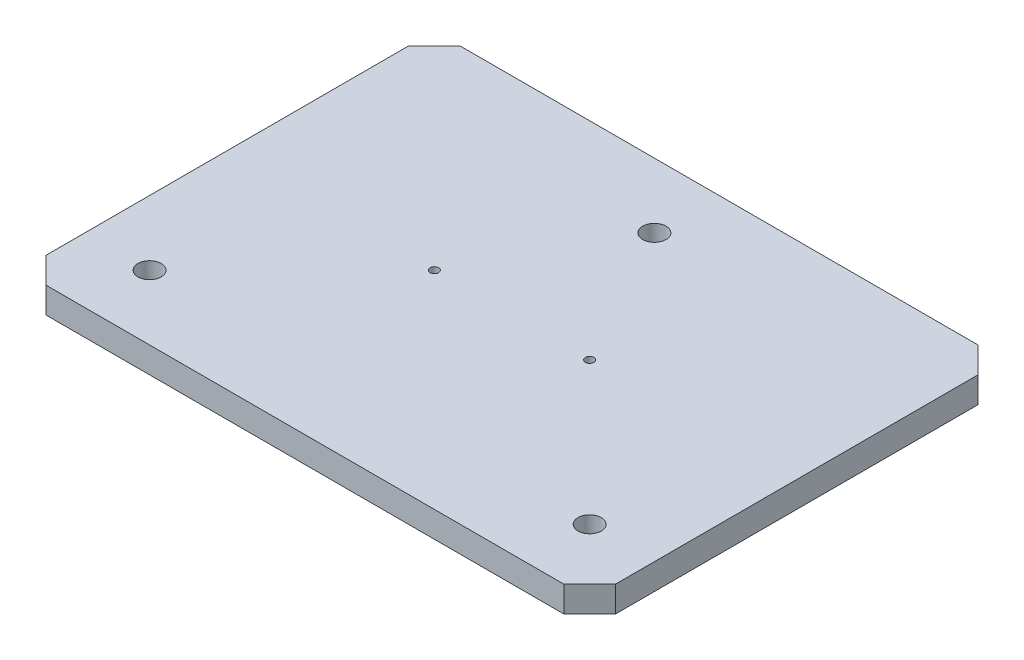
ISO-10303-21;
HEADER;
FILE_DESCRIPTION(('STEP AP214'),'2;1');
FILE_NAME('part.step','',(''),(''),'','','');
FILE_SCHEMA(('AUTOMOTIVE_DESIGN { 1 0 10303 214 1 1 1 1 }'));
ENDSEC;
DATA;
#1=APPLICATION_CONTEXT('core data for automotive mechanical design processes');
#2=APPLICATION_PROTOCOL_DEFINITION('international standard','automotive_design',2000,#1);
#3=PRODUCT_CONTEXT('',#1,'mechanical');
#4=PRODUCT('Part','Part','',(#3));
#5=PRODUCT_RELATED_PRODUCT_CATEGORY('part','',(#4));
#6=PRODUCT_DEFINITION_FORMATION('','',#4);
#7=PRODUCT_DEFINITION_CONTEXT('part definition',#1,'design');
#8=PRODUCT_DEFINITION('design','',#6,#7);
#9=PRODUCT_DEFINITION_SHAPE('','',#8);
#10=(LENGTH_UNIT() NAMED_UNIT(*) SI_UNIT(.MILLI.,.METRE.));
#11=(NAMED_UNIT(*) PLANE_ANGLE_UNIT() SI_UNIT($,.RADIAN.));
#12=(NAMED_UNIT(*) SI_UNIT($,.STERADIAN.) SOLID_ANGLE_UNIT());
#13=UNCERTAINTY_MEASURE_WITH_UNIT(LENGTH_MEASURE(1.E-05),#10,'distance_accuracy_value','');
#14=(GEOMETRIC_REPRESENTATION_CONTEXT(3) GLOBAL_UNCERTAINTY_ASSIGNED_CONTEXT((#13)) GLOBAL_UNIT_ASSIGNED_CONTEXT((#10,
#11,#12)) REPRESENTATION_CONTEXT('',''));
#15=CARTESIAN_POINT('',(0.,0.,0.));
#16=DIRECTION('',(0.,0.,1.));
#17=DIRECTION('',(1.,0.,0.));
#18=AXIS2_PLACEMENT_3D('',#15,#16,#17);
#19=CARTESIAN_POINT('',(-110.,10.,80.));
#20=DIRECTION('',(1.,0.,0.));
#21=DIRECTION('',(0.,0.,-1.));
#22=AXIS2_PLACEMENT_3D('',#19,#20,#21);
#23=PLANE('',#22);
#24=DIRECTION('',(0.,0.,1.));
#25=VECTOR('',#24,1.);
#26=CARTESIAN_POINT('',(-110.,10.,80.));
#27=LINE('',#26,#25);
#28=CARTESIAN_POINT('',(-110.,10.,-70.));
#29=VERTEX_POINT('',#28);
#30=CARTESIAN_POINT('',(-110.,10.,70.));
#31=VERTEX_POINT('',#30);
#32=EDGE_CURVE('E135',#29,#31,#27,.T.);
#33=ORIENTED_EDGE('',*,*,#32,.F.);
#34=DIRECTION('',(0.,-1.,0.));
#35=VECTOR('',#34,1.);
#36=CARTESIAN_POINT('',(-110.,10.,-70.));
#37=LINE('',#36,#35);
#38=CARTESIAN_POINT('',(-110.,0.,-70.));
#39=VERTEX_POINT('',#38);
#40=EDGE_CURVE('E120',#29,#39,#37,.T.);
#41=ORIENTED_EDGE('',*,*,#40,.T.);
#42=DIRECTION('',(0.,0.,1.));
#43=VECTOR('',#42,1.);
#44=CARTESIAN_POINT('',(-110.,0.,80.));
#45=LINE('',#44,#43);
#46=CARTESIAN_POINT('',(-110.,0.,70.));
#47=VERTEX_POINT('',#46);
#48=EDGE_CURVE('E132',#39,#47,#45,.T.);
#49=ORIENTED_EDGE('',*,*,#48,.T.);
#50=DIRECTION('',(0.,1.,0.));
#51=VECTOR('',#50,1.);
#52=CARTESIAN_POINT('',(-110.,10.,70.));
#53=LINE('',#52,#51);
#54=EDGE_CURVE('E137',#47,#31,#53,.T.);
#55=ORIENTED_EDGE('',*,*,#54,.T.);
#56=EDGE_LOOP('',(#33,#41,#49,#55));
#57=FACE_BOUND('',#56,.T.);
#58=ADVANCED_FACE('F50',(#57),#23,.F.);
#59=CARTESIAN_POINT('',(110.,10.,80.));
#60=DIRECTION('',(0.,0.,-1.));
#61=DIRECTION('',(-1.,0.,0.));
#62=AXIS2_PLACEMENT_3D('',#59,#60,#61);
#63=PLANE('',#62);
#64=DIRECTION('',(1.,0.,0.));
#65=VECTOR('',#64,1.);
#66=CARTESIAN_POINT('',(110.,0.,80.));
#67=LINE('',#66,#65);
#68=CARTESIAN_POINT('',(-100.,0.,80.));
#69=VERTEX_POINT('',#68);
#70=CARTESIAN_POINT('',(100.,0.,80.));
#71=VERTEX_POINT('',#70);
#72=EDGE_CURVE('E141',#69,#71,#67,.T.);
#73=ORIENTED_EDGE('',*,*,#72,.T.);
#74=DIRECTION('',(0.,1.,0.));
#75=VECTOR('',#74,1.);
#76=CARTESIAN_POINT('',(100.,10.,80.));
#77=LINE('',#76,#75);
#78=CARTESIAN_POINT('',(100.,10.,80.));
#79=VERTEX_POINT('',#78);
#80=EDGE_CURVE('E13',#71,#79,#77,.T.);
#81=ORIENTED_EDGE('',*,*,#80,.T.);
#82=DIRECTION('',(1.,0.,0.));
#83=VECTOR('',#82,1.);
#84=CARTESIAN_POINT('',(110.,10.,80.));
#85=LINE('',#84,#83);
#86=CARTESIAN_POINT('',(-100.,10.,80.));
#87=VERTEX_POINT('',#86);
#88=EDGE_CURVE('E181',#87,#79,#85,.T.);
#89=ORIENTED_EDGE('',*,*,#88,.F.);
#90=DIRECTION('',(0.,-1.,0.));
#91=VECTOR('',#90,1.);
#92=CARTESIAN_POINT('',(-100.,10.,80.));
#93=LINE('',#92,#91);
#94=EDGE_CURVE('E58',#87,#69,#93,.T.);
#95=ORIENTED_EDGE('',*,*,#94,.T.);
#96=EDGE_LOOP('',(#73,#81,#89,#95));
#97=FACE_BOUND('',#96,.T.);
#98=ADVANCED_FACE('F179',(#97),#63,.F.);
#99=CARTESIAN_POINT('',(110.,10.,80.));
#100=DIRECTION('',(-1.,0.,0.));
#101=DIRECTION('',(0.,0.,1.));
#102=AXIS2_PLACEMENT_3D('',#99,#100,#101);
#103=PLANE('',#102);
#104=DIRECTION('',(0.,0.,-1.));
#105=VECTOR('',#104,1.);
#106=CARTESIAN_POINT('',(110.,0.,80.));
#107=LINE('',#106,#105);
#108=CARTESIAN_POINT('',(110.,0.,70.));
#109=VERTEX_POINT('',#108);
#110=CARTESIAN_POINT('',(110.,0.,-70.));
#111=VERTEX_POINT('',#110);
#112=EDGE_CURVE('E145',#109,#111,#107,.T.);
#113=ORIENTED_EDGE('',*,*,#112,.T.);
#114=DIRECTION('',(0.,1.,0.));
#115=VECTOR('',#114,1.);
#116=CARTESIAN_POINT('',(110.,10.,-70.));
#117=LINE('',#116,#115);
#118=CARTESIAN_POINT('',(110.,10.,-70.));
#119=VERTEX_POINT('',#118);
#120=EDGE_CURVE('E65',#111,#119,#117,.T.);
#121=ORIENTED_EDGE('',*,*,#120,.T.);
#122=DIRECTION('',(0.,0.,-1.));
#123=VECTOR('',#122,1.);
#124=CARTESIAN_POINT('',(110.,10.,80.));
#125=LINE('',#124,#123);
#126=CARTESIAN_POINT('',(110.,10.,70.));
#127=VERTEX_POINT('',#126);
#128=EDGE_CURVE('E189',#127,#119,#125,.T.);
#129=ORIENTED_EDGE('',*,*,#128,.F.);
#130=DIRECTION('',(0.,-1.,0.));
#131=VECTOR('',#130,1.);
#132=CARTESIAN_POINT('',(110.,10.,70.));
#133=LINE('',#132,#131);
#134=EDGE_CURVE('E172',#127,#109,#133,.T.);
#135=ORIENTED_EDGE('',*,*,#134,.T.);
#136=EDGE_LOOP('',(#113,#121,#129,#135));
#137=FACE_BOUND('',#136,.T.);
#138=ADVANCED_FACE('F188',(#137),#103,.F.);
#139=CARTESIAN_POINT('',(110.,10.,-80.));
#140=DIRECTION('',(0.,0.,1.));
#141=DIRECTION('',(1.,0.,0.));
#142=AXIS2_PLACEMENT_3D('',#139,#140,#141);
#143=PLANE('',#142);
#144=DIRECTION('',(-1.,0.,0.));
#145=VECTOR('',#144,1.);
#146=CARTESIAN_POINT('',(110.,0.,-80.));
#147=LINE('',#146,#145);
#148=CARTESIAN_POINT('',(100.,0.,-80.));
#149=VERTEX_POINT('',#148);
#150=CARTESIAN_POINT('',(-99.9999999999999,0.,-80.));
#151=VERTEX_POINT('',#150);
#152=EDGE_CURVE('E155',#149,#151,#147,.T.);
#153=ORIENTED_EDGE('',*,*,#152,.T.);
#154=DIRECTION('',(0.,1.,0.));
#155=VECTOR('',#154,1.);
#156=CARTESIAN_POINT('',(-99.9999999999999,10.,-80.));
#157=LINE('',#156,#155);
#158=CARTESIAN_POINT('',(-99.9999999999999,10.,-80.));
#159=VERTEX_POINT('',#158);
#160=EDGE_CURVE('E121',#151,#159,#157,.T.);
#161=ORIENTED_EDGE('',*,*,#160,.T.);
#162=DIRECTION('',(-1.,0.,0.));
#163=VECTOR('',#162,1.);
#164=CARTESIAN_POINT('',(110.,10.,-80.));
#165=LINE('',#164,#163);
#166=CARTESIAN_POINT('',(100.,10.,-80.));
#167=VERTEX_POINT('',#166);
#168=EDGE_CURVE('E151',#167,#159,#165,.T.);
#169=ORIENTED_EDGE('',*,*,#168,.F.);
#170=DIRECTION('',(0.,-1.,0.));
#171=VECTOR('',#170,1.);
#172=CARTESIAN_POINT('',(100.,10.,-80.));
#173=LINE('',#172,#171);
#174=EDGE_CURVE('E126',#167,#149,#173,.T.);
#175=ORIENTED_EDGE('',*,*,#174,.T.);
#176=EDGE_LOOP('',(#153,#161,#169,#175));
#177=FACE_BOUND('',#176,.T.);
#178=ADVANCED_FACE('F227',(#177),#143,.F.);
#179=CARTESIAN_POINT('',(0.,10.,0.));
#180=DIRECTION('',(0.,1.,0.));
#181=DIRECTION('',(0.,0.,1.));
#182=AXIS2_PLACEMENT_3D('',#179,#180,#181);
#183=PLANE('',#182);
#184=CARTESIAN_POINT('',(-30.,10.,0.));
#185=DIRECTION('',(0.,1.,0.));
#186=DIRECTION('',(0.,0.,1.));
#187=AXIS2_PLACEMENT_3D('',#184,#185,#186);
#188=CIRCLE('',#187,1.64999999999999);
#189=CARTESIAN_POINT('',(-30.,10.,1.64999999999999));
#190=VERTEX_POINT('',#189);
#191=EDGE_CURVE('E218',#190,#190,#188,.T.);
#192=ORIENTED_EDGE('',*,*,#191,.F.);
#193=EDGE_LOOP('',(#192));
#194=FACE_BOUND('',#193,.T.);
#195=CARTESIAN_POINT('',(30.,10.,0.));
#196=DIRECTION('',(0.,1.,0.));
#197=DIRECTION('',(0.,0.,1.));
#198=AXIS2_PLACEMENT_3D('',#195,#196,#197);
#199=CIRCLE('',#198,1.64999999999998);
#200=CARTESIAN_POINT('',(30.,10.,1.64999999999998));
#201=VERTEX_POINT('',#200);
#202=EDGE_CURVE('E212',#201,#201,#199,.T.);
#203=ORIENTED_EDGE('',*,*,#202,.F.);
#204=EDGE_LOOP('',(#203));
#205=FACE_BOUND('',#204,.T.);
#206=CARTESIAN_POINT('',(0.,10.,-55.));
#207=DIRECTION('',(0.,1.,0.));
#208=DIRECTION('',(0.,0.,1.));
#209=AXIS2_PLACEMENT_3D('',#206,#207,#208);
#210=CIRCLE('',#209,4.5);
#211=CARTESIAN_POINT('',(0.,10.,-50.5));
#212=VERTEX_POINT('',#211);
#213=EDGE_CURVE('E206',#212,#212,#210,.T.);
#214=ORIENTED_EDGE('',*,*,#213,.F.);
#215=EDGE_LOOP('',(#214));
#216=FACE_BOUND('',#215,.T.);
#217=CARTESIAN_POINT('',(-85.,10.,55.));
#218=DIRECTION('',(0.,1.,0.));
#219=DIRECTION('',(0.,0.,1.));
#220=AXIS2_PLACEMENT_3D('',#217,#218,#219);
#221=CIRCLE('',#220,4.5);
#222=CARTESIAN_POINT('',(-85.,10.,59.5));
#223=VERTEX_POINT('',#222);
#224=EDGE_CURVE('E200',#223,#223,#221,.T.);
#225=ORIENTED_EDGE('',*,*,#224,.F.);
#226=EDGE_LOOP('',(#225));
#227=FACE_BOUND('',#226,.T.);
#228=CARTESIAN_POINT('',(85.,10.,55.));
#229=DIRECTION('',(0.,1.,0.));
#230=DIRECTION('',(0.,0.,1.));
#231=AXIS2_PLACEMENT_3D('',#228,#229,#230);
#232=CIRCLE('',#231,4.5);
#233=CARTESIAN_POINT('',(85.,10.,59.5));
#234=VERTEX_POINT('',#233);
#235=EDGE_CURVE('E148',#234,#234,#232,.T.);
#236=ORIENTED_EDGE('',*,*,#235,.F.);
#237=EDGE_LOOP('',(#236));
#238=FACE_BOUND('',#237,.T.);
#239=ORIENTED_EDGE('',*,*,#168,.T.);
#240=DIRECTION('',(0.707106781186548,0.,-0.707106781186547));
#241=VECTOR('',#240,1.);
#242=CARTESIAN_POINT('',(-89.9999999999999,10.,-90.));
#243=LINE('',#242,#241);
#244=EDGE_CURVE('E170',#159,#29,#243,.F.);
#245=ORIENTED_EDGE('',*,*,#244,.T.);
#246=ORIENTED_EDGE('',*,*,#32,.T.);
#247=DIRECTION('',(-0.707106781186546,0.,-0.707106781186549));
#248=VECTOR('',#247,1.);
#249=CARTESIAN_POINT('',(-90.0000000000002,10.,89.9999999999999));
#250=LINE('',#249,#248);
#251=EDGE_CURVE('E165',#31,#87,#250,.F.);
#252=ORIENTED_EDGE('',*,*,#251,.T.);
#253=ORIENTED_EDGE('',*,*,#88,.T.);
#254=DIRECTION('',(-0.707106781186549,0.,0.707106781186547));
#255=VECTOR('',#254,1.);
#256=CARTESIAN_POINT('',(89.9999999999998,10.,90.0000000000001));
#257=LINE('',#256,#255);
#258=EDGE_CURVE('E72',#79,#127,#257,.F.);
#259=ORIENTED_EDGE('',*,*,#258,.T.);
#260=ORIENTED_EDGE('',*,*,#128,.T.);
#261=DIRECTION('',(0.707106781186547,0.,0.707106781186549));
#262=VECTOR('',#261,1.);
#263=CARTESIAN_POINT('',(90.0000000000002,10.,-89.9999999999999));
#264=LINE('',#263,#262);
#265=EDGE_CURVE('E168',#119,#167,#264,.F.);
#266=ORIENTED_EDGE('',*,*,#265,.T.);
#267=EDGE_LOOP('',(#239,#245,#246,#252,#253,#259,#260,#266));
#268=FACE_BOUND('',#267,.T.);
#269=ADVANCED_FACE('F224',(#194,#205,#216,#227,#238,#268),#183,.T.);
#270=CARTESIAN_POINT('',(0.,0.,0.));
#271=DIRECTION('',(0.,1.,0.));
#272=DIRECTION('',(0.,0.,1.));
#273=AXIS2_PLACEMENT_3D('',#270,#271,#272);
#274=PLANE('',#273);
#275=CARTESIAN_POINT('',(-30.,0.,0.));
#276=DIRECTION('',(0.,1.,0.));
#277=DIRECTION('',(0.,0.,1.));
#278=AXIS2_PLACEMENT_3D('',#275,#276,#277);
#279=CIRCLE('',#278,1.64999999999999);
#280=CARTESIAN_POINT('',(-30.,0.,1.64999999999999));
#281=VERTEX_POINT('',#280);
#282=EDGE_CURVE('E215',#281,#281,#279,.T.);
#283=ORIENTED_EDGE('',*,*,#282,.T.);
#284=EDGE_LOOP('',(#283));
#285=FACE_BOUND('',#284,.T.);
#286=CARTESIAN_POINT('',(30.,0.,0.));
#287=DIRECTION('',(0.,1.,0.));
#288=DIRECTION('',(0.,0.,1.));
#289=AXIS2_PLACEMENT_3D('',#286,#287,#288);
#290=CIRCLE('',#289,1.64999999999998);
#291=CARTESIAN_POINT('',(30.,0.,1.64999999999998));
#292=VERTEX_POINT('',#291);
#293=EDGE_CURVE('E209',#292,#292,#290,.T.);
#294=ORIENTED_EDGE('',*,*,#293,.T.);
#295=EDGE_LOOP('',(#294));
#296=FACE_BOUND('',#295,.T.);
#297=CARTESIAN_POINT('',(0.,0.,-55.));
#298=DIRECTION('',(0.,1.,0.));
#299=DIRECTION('',(0.,0.,1.));
#300=AXIS2_PLACEMENT_3D('',#297,#298,#299);
#301=CIRCLE('',#300,4.5);
#302=CARTESIAN_POINT('',(0.,0.,-50.5));
#303=VERTEX_POINT('',#302);
#304=EDGE_CURVE('E203',#303,#303,#301,.T.);
#305=ORIENTED_EDGE('',*,*,#304,.T.);
#306=EDGE_LOOP('',(#305));
#307=FACE_BOUND('',#306,.T.);
#308=CARTESIAN_POINT('',(-85.,0.,55.));
#309=DIRECTION('',(0.,1.,0.));
#310=DIRECTION('',(0.,0.,1.));
#311=AXIS2_PLACEMENT_3D('',#308,#309,#310);
#312=CIRCLE('',#311,4.5);
#313=CARTESIAN_POINT('',(-85.,0.,59.5));
#314=VERTEX_POINT('',#313);
#315=EDGE_CURVE('E197',#314,#314,#312,.T.);
#316=ORIENTED_EDGE('',*,*,#315,.T.);
#317=EDGE_LOOP('',(#316));
#318=FACE_BOUND('',#317,.T.);
#319=CARTESIAN_POINT('',(85.,0.,55.));
#320=DIRECTION('',(0.,1.,0.));
#321=DIRECTION('',(0.,0.,1.));
#322=AXIS2_PLACEMENT_3D('',#319,#320,#321);
#323=CIRCLE('',#322,4.5);
#324=CARTESIAN_POINT('',(85.,0.,59.5));
#325=VERTEX_POINT('',#324);
#326=EDGE_CURVE('E142',#325,#325,#323,.T.);
#327=ORIENTED_EDGE('',*,*,#326,.T.);
#328=EDGE_LOOP('',(#327));
#329=FACE_BOUND('',#328,.T.);
#330=ORIENTED_EDGE('',*,*,#48,.F.);
#331=DIRECTION('',(-0.707106781186548,0.,0.707106781186547));
#332=VECTOR('',#331,1.);
#333=CARTESIAN_POINT('',(-110.,0.,-70.));
#334=LINE('',#333,#332);
#335=EDGE_CURVE('E116',#39,#151,#334,.F.);
#336=ORIENTED_EDGE('',*,*,#335,.T.);
#337=ORIENTED_EDGE('',*,*,#152,.F.);
#338=DIRECTION('',(-0.707106781186547,0.,-0.707106781186549));
#339=VECTOR('',#338,1.);
#340=CARTESIAN_POINT('',(100.,0.,-80.));
#341=LINE('',#340,#339);
#342=EDGE_CURVE('E127',#149,#111,#341,.F.);
#343=ORIENTED_EDGE('',*,*,#342,.T.);
#344=ORIENTED_EDGE('',*,*,#112,.F.);
#345=DIRECTION('',(0.707106781186549,0.,-0.707106781186547));
#346=VECTOR('',#345,1.);
#347=CARTESIAN_POINT('',(110.,0.,70.));
#348=LINE('',#347,#346);
#349=EDGE_CURVE('E159',#109,#71,#348,.F.);
#350=ORIENTED_EDGE('',*,*,#349,.T.);
#351=ORIENTED_EDGE('',*,*,#72,.F.);
#352=DIRECTION('',(0.707106781186546,0.,0.707106781186549));
#353=VECTOR('',#352,1.);
#354=CARTESIAN_POINT('',(-100.,0.,80.));
#355=LINE('',#354,#353);
#356=EDGE_CURVE('E136',#69,#47,#355,.F.);
#357=ORIENTED_EDGE('',*,*,#356,.T.);
#358=EDGE_LOOP('',(#330,#336,#337,#343,#344,#350,#351,#357));
#359=FACE_BOUND('',#358,.T.);
#360=ADVANCED_FACE('F139',(#285,#296,#307,#318,#329,#359),#274,.F.);
#361=CARTESIAN_POINT('',(-110.,10.,-70.));
#362=DIRECTION('',(0.707106781186547,0.,0.707106781186548));
#363=DIRECTION('',(0.,-1.,0.));
#364=AXIS2_PLACEMENT_3D('',#361,#362,#363);
#365=PLANE('',#364);
#366=ORIENTED_EDGE('',*,*,#244,.F.);
#367=ORIENTED_EDGE('',*,*,#160,.F.);
#368=ORIENTED_EDGE('',*,*,#335,.F.);
#369=ORIENTED_EDGE('',*,*,#40,.F.);
#370=EDGE_LOOP('',(#366,#367,#368,#369));
#371=FACE_BOUND('',#370,.T.);
#372=ADVANCED_FACE('F119',(#371),#365,.F.);
#373=CARTESIAN_POINT('',(100.,10.,-80.));
#374=DIRECTION('',(-0.707106781186548,0.,0.707106781186546));
#375=DIRECTION('',(0.,-1.,0.));
#376=AXIS2_PLACEMENT_3D('',#373,#374,#375);
#377=PLANE('',#376);
#378=ORIENTED_EDGE('',*,*,#265,.F.);
#379=ORIENTED_EDGE('',*,*,#120,.F.);
#380=ORIENTED_EDGE('',*,*,#342,.F.);
#381=ORIENTED_EDGE('',*,*,#174,.F.);
#382=EDGE_LOOP('',(#378,#379,#380,#381));
#383=FACE_BOUND('',#382,.T.);
#384=ADVANCED_FACE('F240',(#383),#377,.F.);
#385=CARTESIAN_POINT('',(110.,10.,70.));
#386=DIRECTION('',(-0.707106781186546,0.,-0.707106781186548));
#387=DIRECTION('',(0.,-1.,0.));
#388=AXIS2_PLACEMENT_3D('',#385,#386,#387);
#389=PLANE('',#388);
#390=ORIENTED_EDGE('',*,*,#258,.F.);
#391=ORIENTED_EDGE('',*,*,#80,.F.);
#392=ORIENTED_EDGE('',*,*,#349,.F.);
#393=ORIENTED_EDGE('',*,*,#134,.F.);
#394=EDGE_LOOP('',(#390,#391,#392,#393));
#395=FACE_BOUND('',#394,.T.);
#396=ADVANCED_FACE('F187',(#395),#389,.F.);
#397=CARTESIAN_POINT('',(-100.,10.,80.));
#398=DIRECTION('',(0.707106781186549,0.,-0.707106781186546));
#399=DIRECTION('',(0.,-1.,0.));
#400=AXIS2_PLACEMENT_3D('',#397,#398,#399);
#401=PLANE('',#400);
#402=ORIENTED_EDGE('',*,*,#251,.F.);
#403=ORIENTED_EDGE('',*,*,#54,.F.);
#404=ORIENTED_EDGE('',*,*,#356,.F.);
#405=ORIENTED_EDGE('',*,*,#94,.F.);
#406=EDGE_LOOP('',(#402,#403,#404,#405));
#407=FACE_BOUND('',#406,.T.);
#408=ADVANCED_FACE('F52',(#407),#401,.F.);
#409=CARTESIAN_POINT('',(85.,10.,55.));
#410=DIRECTION('',(0.,1.,0.));
#411=DIRECTION('',(0.,0.,1.));
#412=AXIS2_PLACEMENT_3D('',#409,#410,#411);
#413=CYLINDRICAL_SURFACE('',#412,4.5);
#414=ORIENTED_EDGE('',*,*,#326,.F.);
#415=EDGE_LOOP('',(#414));
#416=FACE_BOUND('',#415,.T.);
#417=ORIENTED_EDGE('',*,*,#235,.T.);
#418=EDGE_LOOP('',(#417));
#419=FACE_BOUND('',#418,.T.);
#420=ADVANCED_FACE('F262',(#416,#419),#413,.F.);
#421=CARTESIAN_POINT('',(-85.,10.,55.));
#422=DIRECTION('',(0.,1.,0.));
#423=DIRECTION('',(0.,0.,1.));
#424=AXIS2_PLACEMENT_3D('',#421,#422,#423);
#425=CYLINDRICAL_SURFACE('',#424,4.5);
#426=ORIENTED_EDGE('',*,*,#315,.F.);
#427=EDGE_LOOP('',(#426));
#428=FACE_BOUND('',#427,.T.);
#429=ORIENTED_EDGE('',*,*,#224,.T.);
#430=EDGE_LOOP('',(#429));
#431=FACE_BOUND('',#430,.T.);
#432=ADVANCED_FACE('F265',(#428,#431),#425,.F.);
#433=CARTESIAN_POINT('',(0.,10.,-55.));
#434=DIRECTION('',(0.,1.,0.));
#435=DIRECTION('',(0.,0.,1.));
#436=AXIS2_PLACEMENT_3D('',#433,#434,#435);
#437=CYLINDRICAL_SURFACE('',#436,4.5);
#438=ORIENTED_EDGE('',*,*,#304,.F.);
#439=EDGE_LOOP('',(#438));
#440=FACE_BOUND('',#439,.T.);
#441=ORIENTED_EDGE('',*,*,#213,.T.);
#442=EDGE_LOOP('',(#441));
#443=FACE_BOUND('',#442,.T.);
#444=ADVANCED_FACE('F269',(#440,#443),#437,.F.);
#445=CARTESIAN_POINT('',(30.,10.,0.));
#446=DIRECTION('',(0.,1.,0.));
#447=DIRECTION('',(0.,0.,1.));
#448=AXIS2_PLACEMENT_3D('',#445,#446,#447);
#449=CYLINDRICAL_SURFACE('',#448,1.64999999999998);
#450=ORIENTED_EDGE('',*,*,#293,.F.);
#451=EDGE_LOOP('',(#450));
#452=FACE_BOUND('',#451,.T.);
#453=ORIENTED_EDGE('',*,*,#202,.T.);
#454=EDGE_LOOP('',(#453));
#455=FACE_BOUND('',#454,.T.);
#456=ADVANCED_FACE('F273',(#452,#455),#449,.F.);
#457=CARTESIAN_POINT('',(-30.,10.,0.));
#458=DIRECTION('',(0.,1.,0.));
#459=DIRECTION('',(0.,0.,1.));
#460=AXIS2_PLACEMENT_3D('',#457,#458,#459);
#461=CYLINDRICAL_SURFACE('',#460,1.64999999999999);
#462=ORIENTED_EDGE('',*,*,#282,.F.);
#463=EDGE_LOOP('',(#462));
#464=FACE_BOUND('',#463,.T.);
#465=ORIENTED_EDGE('',*,*,#191,.T.);
#466=EDGE_LOOP('',(#465));
#467=FACE_BOUND('',#466,.T.);
#468=ADVANCED_FACE('F222',(#464,#467),#461,.F.);
#469=CLOSED_SHELL('',(#58,#98,#138,#178,#269,#360,#372,#384,#396,#408,#420,#432,#444,#456,#468));
#470=MANIFOLD_SOLID_BREP('B2',#469);
#471=ADVANCED_BREP_SHAPE_REPRESENTATION('',(#18,#470),#14);
#472=SHAPE_DEFINITION_REPRESENTATION(#9,#471);
ENDSEC;
END-ISO-10303-21;
